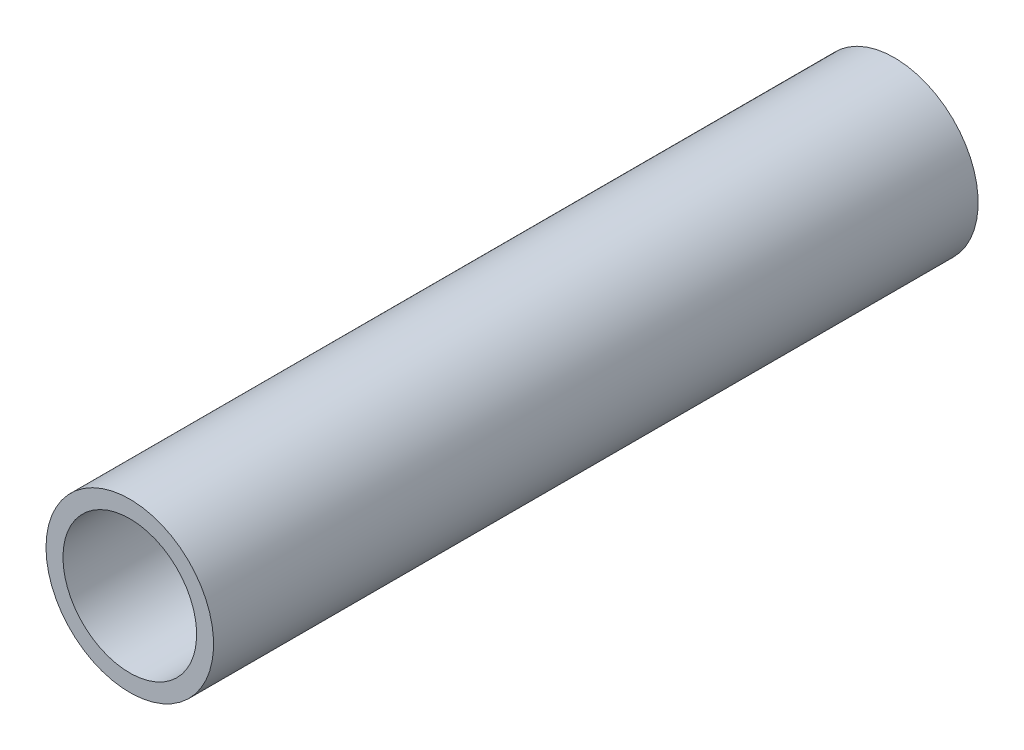
ISO-10303-21;
HEADER;
FILE_DESCRIPTION(('STEP AP214'),'2;1');
FILE_NAME('part.step','',(''),(''),'','','');
FILE_SCHEMA(('AUTOMOTIVE_DESIGN { 1 0 10303 214 1 1 1 1 }'));
ENDSEC;
DATA;
#1=APPLICATION_CONTEXT('core data for automotive mechanical design processes');
#2=APPLICATION_PROTOCOL_DEFINITION('international standard','automotive_design',2000,#1);
#3=PRODUCT_CONTEXT('',#1,'mechanical');
#4=PRODUCT('Part','Part','',(#3));
#5=PRODUCT_RELATED_PRODUCT_CATEGORY('part','',(#4));
#6=PRODUCT_DEFINITION_FORMATION('','',#4);
#7=PRODUCT_DEFINITION_CONTEXT('part definition',#1,'design');
#8=PRODUCT_DEFINITION('design','',#6,#7);
#9=PRODUCT_DEFINITION_SHAPE('','',#8);
#10=(LENGTH_UNIT() NAMED_UNIT(*) SI_UNIT(.MILLI.,.METRE.));
#11=(NAMED_UNIT(*) PLANE_ANGLE_UNIT() SI_UNIT($,.RADIAN.));
#12=(NAMED_UNIT(*) SI_UNIT($,.STERADIAN.) SOLID_ANGLE_UNIT());
#13=UNCERTAINTY_MEASURE_WITH_UNIT(LENGTH_MEASURE(1.E-05),#10,'distance_accuracy_value','');
#14=(GEOMETRIC_REPRESENTATION_CONTEXT(3) GLOBAL_UNCERTAINTY_ASSIGNED_CONTEXT((#13)) GLOBAL_UNIT_ASSIGNED_CONTEXT((#10,
#11,#12)) REPRESENTATION_CONTEXT('',''));
#15=CARTESIAN_POINT('',(0.,0.,0.));
#16=DIRECTION('',(0.,0.,1.));
#17=DIRECTION('',(1.,0.,0.));
#18=AXIS2_PLACEMENT_3D('',#15,#16,#17);
#19=CARTESIAN_POINT('',(0.,0.,76.2));
#20=DIRECTION('',(0.,0.,1.));
#21=DIRECTION('',(1.,0.,0.));
#22=AXIS2_PLACEMENT_3D('',#19,#20,#21);
#23=PLANE('',#22);
#24=CARTESIAN_POINT('',(0.,0.,76.2));
#25=DIRECTION('',(0.,0.,1.));
#26=DIRECTION('',(1.,0.,0.));
#27=AXIS2_PLACEMENT_3D('',#24,#25,#26);
#28=CIRCLE('',#27,16.7005);
#29=CARTESIAN_POINT('',(-16.7005,0.,76.2));
#30=VERTEX_POINT('',#29);
#31=EDGE_CURVE('E11',#30,#30,#28,.T.);
#32=ORIENTED_EDGE('',*,*,#31,.T.);
#33=EDGE_LOOP('',(#32));
#34=FACE_BOUND('',#33,.T.);
#35=CARTESIAN_POINT('',(0.,0.,76.2));
#36=DIRECTION('',(0.,0.,1.));
#37=DIRECTION('',(1.,0.,0.));
#38=AXIS2_PLACEMENT_3D('',#35,#36,#37);
#39=CIRCLE('',#38,13.3223);
#40=CARTESIAN_POINT('',(-13.3223,0.,76.2));
#41=VERTEX_POINT('',#40);
#42=EDGE_CURVE('E52',#41,#41,#39,.T.);
#43=ORIENTED_EDGE('',*,*,#42,.F.);
#44=EDGE_LOOP('',(#43));
#45=FACE_BOUND('',#44,.T.);
#46=ADVANCED_FACE('F41',(#34,#45),#23,.T.);
#47=CARTESIAN_POINT('',(0.,0.,-76.2));
#48=DIRECTION('',(0.,0.,1.));
#49=DIRECTION('',(1.,0.,0.));
#50=AXIS2_PLACEMENT_3D('',#47,#48,#49);
#51=PLANE('',#50);
#52=CARTESIAN_POINT('',(0.,0.,-76.2));
#53=DIRECTION('',(0.,0.,1.));
#54=DIRECTION('',(1.,0.,0.));
#55=AXIS2_PLACEMENT_3D('',#52,#53,#54);
#56=CIRCLE('',#55,16.7005);
#57=CARTESIAN_POINT('',(-16.7005,0.,-76.2));
#58=VERTEX_POINT('',#57);
#59=EDGE_CURVE('E45',#58,#58,#56,.T.);
#60=ORIENTED_EDGE('',*,*,#59,.F.);
#61=EDGE_LOOP('',(#60));
#62=FACE_BOUND('',#61,.T.);
#63=CARTESIAN_POINT('',(0.,0.,-76.2));
#64=DIRECTION('',(0.,0.,1.));
#65=DIRECTION('',(1.,0.,0.));
#66=AXIS2_PLACEMENT_3D('',#63,#64,#65);
#67=CIRCLE('',#66,13.3223);
#68=CARTESIAN_POINT('',(-13.3223,0.,-76.2));
#69=VERTEX_POINT('',#68);
#70=EDGE_CURVE('E54',#69,#69,#67,.T.);
#71=ORIENTED_EDGE('',*,*,#70,.T.);
#72=EDGE_LOOP('',(#71));
#73=FACE_BOUND('',#72,.T.);
#74=ADVANCED_FACE('F64',(#62,#73),#51,.F.);
#75=CARTESIAN_POINT('',(0.,0.,76.2));
#76=DIRECTION('',(0.,0.,-1.));
#77=DIRECTION('',(-1.,0.,0.));
#78=AXIS2_PLACEMENT_3D('',#75,#76,#77);
#79=CYLINDRICAL_SURFACE('',#78,16.7005);
#80=CARTESIAN_POINT('',(-16.7005,0.,76.2));
#81=CARTESIAN_POINT('',(-16.7005,0.,74.6125));
#82=CARTESIAN_POINT('',(-16.7005,0.,73.025));
#83=CARTESIAN_POINT('',(-16.7005,0.,69.85));
#84=CARTESIAN_POINT('',(-16.7005,0.,68.2625));
#85=CARTESIAN_POINT('',(-16.7005,0.,65.0875));
#86=CARTESIAN_POINT('',(-16.7005,0.,63.5));
#87=CARTESIAN_POINT('',(-16.7005,0.,60.325));
#88=CARTESIAN_POINT('',(-16.7005,0.,58.7375));
#89=CARTESIAN_POINT('',(-16.7005,0.,55.5625));
#90=CARTESIAN_POINT('',(-16.7005,0.,53.975));
#91=CARTESIAN_POINT('',(-16.7005,0.,50.8));
#92=CARTESIAN_POINT('',(-16.7005,0.,49.2125));
#93=CARTESIAN_POINT('',(-16.7005,0.,46.0375));
#94=CARTESIAN_POINT('',(-16.7005,0.,44.45));
#95=CARTESIAN_POINT('',(-16.7005,0.,41.275));
#96=CARTESIAN_POINT('',(-16.7005,0.,39.6875));
#97=CARTESIAN_POINT('',(-16.7005,0.,36.5125));
#98=CARTESIAN_POINT('',(-16.7005,0.,34.925));
#99=CARTESIAN_POINT('',(-16.7005,0.,31.75));
#100=CARTESIAN_POINT('',(-16.7005,0.,30.1625));
#101=CARTESIAN_POINT('',(-16.7005,0.,26.9875));
#102=CARTESIAN_POINT('',(-16.7005,0.,25.4));
#103=CARTESIAN_POINT('',(-16.7005,0.,22.225));
#104=CARTESIAN_POINT('',(-16.7005,0.,20.6375));
#105=CARTESIAN_POINT('',(-16.7005,0.,17.4625));
#106=CARTESIAN_POINT('',(-16.7005,0.,15.875));
#107=CARTESIAN_POINT('',(-16.7005,0.,12.7));
#108=CARTESIAN_POINT('',(-16.7005,0.,11.1125));
#109=CARTESIAN_POINT('',(-16.7005,0.,7.93750000000001));
#110=CARTESIAN_POINT('',(-16.7005,0.,6.35));
#111=CARTESIAN_POINT('',(-16.7005,0.,3.175));
#112=CARTESIAN_POINT('',(-16.7005,0.,1.5875));
#113=CARTESIAN_POINT('',(-16.7005,0.,-1.5875));
#114=CARTESIAN_POINT('',(-16.7005,0.,-3.175));
#115=CARTESIAN_POINT('',(-16.7005,0.,-6.35));
#116=CARTESIAN_POINT('',(-16.7005,0.,-7.93750000000001));
#117=CARTESIAN_POINT('',(-16.7005,0.,-11.1125));
#118=CARTESIAN_POINT('',(-16.7005,0.,-12.7));
#119=CARTESIAN_POINT('',(-16.7005,0.,-15.875));
#120=CARTESIAN_POINT('',(-16.7005,0.,-17.4625));
#121=CARTESIAN_POINT('',(-16.7005,0.,-20.6375));
#122=CARTESIAN_POINT('',(-16.7005,0.,-22.225));
#123=CARTESIAN_POINT('',(-16.7005,0.,-25.4));
#124=CARTESIAN_POINT('',(-16.7005,0.,-26.9875));
#125=CARTESIAN_POINT('',(-16.7005,0.,-30.1625));
#126=CARTESIAN_POINT('',(-16.7005,0.,-31.75));
#127=CARTESIAN_POINT('',(-16.7005,0.,-34.925));
#128=CARTESIAN_POINT('',(-16.7005,0.,-36.5125));
#129=CARTESIAN_POINT('',(-16.7005,0.,-39.6875));
#130=CARTESIAN_POINT('',(-16.7005,0.,-41.275));
#131=CARTESIAN_POINT('',(-16.7005,0.,-44.45));
#132=CARTESIAN_POINT('',(-16.7005,0.,-46.0375));
#133=CARTESIAN_POINT('',(-16.7005,0.,-49.2125));
#134=CARTESIAN_POINT('',(-16.7005,0.,-50.8));
#135=CARTESIAN_POINT('',(-16.7005,0.,-53.975));
#136=CARTESIAN_POINT('',(-16.7005,0.,-55.5625));
#137=CARTESIAN_POINT('',(-16.7005,0.,-58.7375));
#138=CARTESIAN_POINT('',(-16.7005,0.,-60.325));
#139=CARTESIAN_POINT('',(-16.7005,0.,-63.5));
#140=CARTESIAN_POINT('',(-16.7005,0.,-65.0875));
#141=CARTESIAN_POINT('',(-16.7005,0.,-68.2625));
#142=CARTESIAN_POINT('',(-16.7005,0.,-69.85));
#143=CARTESIAN_POINT('',(-16.7005,0.,-73.025));
#144=CARTESIAN_POINT('',(-16.7005,0.,-74.6125));
#145=CARTESIAN_POINT('',(-16.7005,0.,-76.2));
#146=B_SPLINE_CURVE_WITH_KNOTS('',3,(#80,#81,#82,#83,#84,#85,#86,#87,#88,#89,#90,#91,#92,#93,
#94,#95,#96,#97,#98,#99,#100,#101,#102,#103,#104,#105,#106,#107,#108,#109,#110,#111,#112,#113,
#114,#115,#116,#117,#118,#119,#120,#121,#122,#123,#124,#125,#126,#127,#128,#129,#130,#131,#132,
#133,#134,#135,#136,#137,#138,#139,#140,#141,#142,#143,#144,#145),.UNSPECIFIED.,.F.,.F.,(4,2,2,
2,2,2,2,2,2,2,2,2,2,2,2,2,2,2,2,2,2,2,2,2,2,2,2,2,2,2,2,2,4),(0.,4.7625,9.52500000000001,
14.2875,19.05,23.8125,28.575,33.3375,38.1,42.8625,47.625,52.3875,57.15,61.9125,66.675,71.4375,
76.2,80.9625,85.725,90.4875,95.25,100.0125,104.775,109.5375,114.3,119.0625,123.825,128.5875,
133.35,138.1125,142.875,147.6375,152.4),.UNSPECIFIED.);
#147=EDGE_CURVE('BSEAM43',#30,#58,#146,.T.);
#148=ORIENTED_EDGE('',*,*,#31,.F.);
#149=ORIENTED_EDGE('',*,*,#59,.T.);
#150=ORIENTED_EDGE('',*,*,#147,.T.);
#151=ORIENTED_EDGE('',*,*,#147,.F.);
#152=EDGE_LOOP('',(#148,#150,#149,#151));
#153=FACE_BOUND('',#152,.T.);
#154=ADVANCED_FACE('F43',(#153),#79,.T.);
#155=CARTESIAN_POINT('',(0.,0.,76.2));
#156=DIRECTION('',(0.,0.,-1.));
#157=DIRECTION('',(-1.,0.,0.));
#158=AXIS2_PLACEMENT_3D('',#155,#156,#157);
#159=CYLINDRICAL_SURFACE('',#158,13.3223);
#160=CARTESIAN_POINT('',(-13.3223,0.,76.2));
#161=CARTESIAN_POINT('',(-13.3223,0.,74.6125));
#162=CARTESIAN_POINT('',(-13.3223,0.,73.025));
#163=CARTESIAN_POINT('',(-13.3223,0.,69.85));
#164=CARTESIAN_POINT('',(-13.3223,0.,68.2625));
#165=CARTESIAN_POINT('',(-13.3223,0.,65.0875));
#166=CARTESIAN_POINT('',(-13.3223,0.,63.5));
#167=CARTESIAN_POINT('',(-13.3223,0.,60.325));
#168=CARTESIAN_POINT('',(-13.3223,0.,58.7375));
#169=CARTESIAN_POINT('',(-13.3223,0.,55.5625));
#170=CARTESIAN_POINT('',(-13.3223,0.,53.975));
#171=CARTESIAN_POINT('',(-13.3223,0.,50.8));
#172=CARTESIAN_POINT('',(-13.3223,0.,49.2125));
#173=CARTESIAN_POINT('',(-13.3223,0.,46.0375));
#174=CARTESIAN_POINT('',(-13.3223,0.,44.45));
#175=CARTESIAN_POINT('',(-13.3223,0.,41.275));
#176=CARTESIAN_POINT('',(-13.3223,0.,39.6875));
#177=CARTESIAN_POINT('',(-13.3223,0.,36.5125));
#178=CARTESIAN_POINT('',(-13.3223,0.,34.925));
#179=CARTESIAN_POINT('',(-13.3223,0.,31.75));
#180=CARTESIAN_POINT('',(-13.3223,0.,30.1625));
#181=CARTESIAN_POINT('',(-13.3223,0.,26.9875));
#182=CARTESIAN_POINT('',(-13.3223,0.,25.4));
#183=CARTESIAN_POINT('',(-13.3223,0.,22.225));
#184=CARTESIAN_POINT('',(-13.3223,0.,20.6375));
#185=CARTESIAN_POINT('',(-13.3223,0.,17.4625));
#186=CARTESIAN_POINT('',(-13.3223,0.,15.875));
#187=CARTESIAN_POINT('',(-13.3223,0.,12.7));
#188=CARTESIAN_POINT('',(-13.3223,0.,11.1125));
#189=CARTESIAN_POINT('',(-13.3223,0.,7.93749999999999));
#190=CARTESIAN_POINT('',(-13.3223,0.,6.34999999999999));
#191=CARTESIAN_POINT('',(-13.3223,0.,3.17499999999999));
#192=CARTESIAN_POINT('',(-13.3223,0.,1.58749999999999));
#193=CARTESIAN_POINT('',(-13.3223,0.,-1.58750000000001));
#194=CARTESIAN_POINT('',(-13.3223,0.,-3.17500000000002));
#195=CARTESIAN_POINT('',(-13.3223,0.,-6.35000000000002));
#196=CARTESIAN_POINT('',(-13.3223,0.,-7.93750000000002));
#197=CARTESIAN_POINT('',(-13.3223,0.,-11.1125));
#198=CARTESIAN_POINT('',(-13.3223,0.,-12.7));
#199=CARTESIAN_POINT('',(-13.3223,0.,-15.875));
#200=CARTESIAN_POINT('',(-13.3223,0.,-17.4625));
#201=CARTESIAN_POINT('',(-13.3223,0.,-20.6375));
#202=CARTESIAN_POINT('',(-13.3223,0.,-22.225));
#203=CARTESIAN_POINT('',(-13.3223,0.,-25.4));
#204=CARTESIAN_POINT('',(-13.3223,0.,-26.9875));
#205=CARTESIAN_POINT('',(-13.3223,0.,-30.1625));
#206=CARTESIAN_POINT('',(-13.3223,0.,-31.75));
#207=CARTESIAN_POINT('',(-13.3223,0.,-34.925));
#208=CARTESIAN_POINT('',(-13.3223,0.,-36.5125));
#209=CARTESIAN_POINT('',(-13.3223,0.,-39.6875));
#210=CARTESIAN_POINT('',(-13.3223,0.,-41.275));
#211=CARTESIAN_POINT('',(-13.3223,0.,-44.45));
#212=CARTESIAN_POINT('',(-13.3223,0.,-46.0375));
#213=CARTESIAN_POINT('',(-13.3223,0.,-49.2125));
#214=CARTESIAN_POINT('',(-13.3223,0.,-50.8));
#215=CARTESIAN_POINT('',(-13.3223,0.,-53.975));
#216=CARTESIAN_POINT('',(-13.3223,0.,-55.5625));
#217=CARTESIAN_POINT('',(-13.3223,0.,-58.7375));
#218=CARTESIAN_POINT('',(-13.3223,0.,-60.325));
#219=CARTESIAN_POINT('',(-13.3223,0.,-63.5));
#220=CARTESIAN_POINT('',(-13.3223,0.,-65.0875));
#221=CARTESIAN_POINT('',(-13.3223,0.,-68.2625));
#222=CARTESIAN_POINT('',(-13.3223,0.,-69.85));
#223=CARTESIAN_POINT('',(-13.3223,0.,-73.025));
#224=CARTESIAN_POINT('',(-13.3223,0.,-74.6125));
#225=CARTESIAN_POINT('',(-13.3223,0.,-76.2));
#226=B_SPLINE_CURVE_WITH_KNOTS('',3,(#160,#161,#162,#163,#164,#165,#166,#167,#168,#169,#170,
#171,#172,#173,#174,#175,#176,#177,#178,#179,#180,#181,#182,#183,#184,#185,#186,#187,#188,#189,
#190,#191,#192,#193,#194,#195,#196,#197,#198,#199,#200,#201,#202,#203,#204,#205,#206,#207,#208,
#209,#210,#211,#212,#213,#214,#215,#216,#217,#218,#219,#220,#221,#222,#223,#224,#225),
.UNSPECIFIED.,.F.,.F.,(4,2,2,2,2,2,2,2,2,2,2,2,2,2,2,2,2,2,2,2,2,2,2,2,2,2,2,2,2,2,2,2,4),(0.,
4.76249999999999,9.52499999999999,14.2875,19.05,23.8125,28.575,33.3375,38.1,42.8625,47.625,
52.3875,57.15,61.9125,66.675,71.4375,76.2,80.9625,85.725,90.4875,95.25,100.0125,104.775,
109.5375,114.3,119.0625,123.825,128.5875,133.35,138.1125,142.875,147.6375,152.4),.UNSPECIFIED.);
#227=EDGE_CURVE('BSEAM60',#41,#69,#226,.T.);
#228=ORIENTED_EDGE('',*,*,#42,.T.);
#229=ORIENTED_EDGE('',*,*,#70,.F.);
#230=ORIENTED_EDGE('',*,*,#227,.T.);
#231=ORIENTED_EDGE('',*,*,#227,.F.);
#232=EDGE_LOOP('',(#228,#230,#229,#231));
#233=FACE_BOUND('',#232,.T.);
#234=ADVANCED_FACE('F60',(#233),#159,.F.);
#235=CLOSED_SHELL('',(#46,#74,#154,#234));
#236=MANIFOLD_SOLID_BREP('B2',#235);
#237=ADVANCED_BREP_SHAPE_REPRESENTATION('',(#18,#236),#14);
#238=SHAPE_DEFINITION_REPRESENTATION(#9,#237);
ENDSEC;
END-ISO-10303-21;
